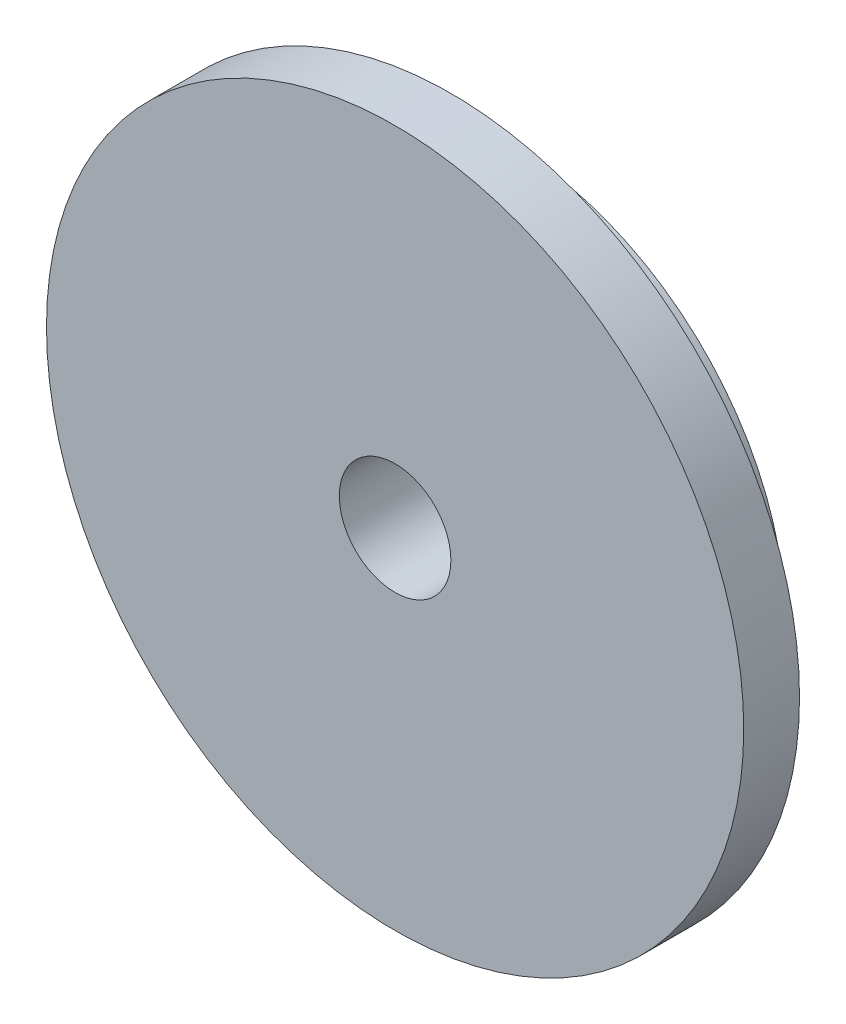
ISO-10303-21;
HEADER;
FILE_DESCRIPTION(('STEP AP214'),'2;1');
FILE_NAME('part.step','',(''),(''),'','','');
FILE_SCHEMA(('AUTOMOTIVE_DESIGN { 1 0 10303 214 1 1 1 1 }'));
ENDSEC;
DATA;
#1=APPLICATION_CONTEXT('core data for automotive mechanical design processes');
#2=APPLICATION_PROTOCOL_DEFINITION('international standard','automotive_design',2000,#1);
#3=PRODUCT_CONTEXT('',#1,'mechanical');
#4=PRODUCT('Part','Part','',(#3));
#5=PRODUCT_RELATED_PRODUCT_CATEGORY('part','',(#4));
#6=PRODUCT_DEFINITION_FORMATION('','',#4);
#7=PRODUCT_DEFINITION_CONTEXT('part definition',#1,'design');
#8=PRODUCT_DEFINITION('design','',#6,#7);
#9=PRODUCT_DEFINITION_SHAPE('','',#8);
#10=(LENGTH_UNIT() NAMED_UNIT(*) SI_UNIT(.MILLI.,.METRE.));
#11=(NAMED_UNIT(*) PLANE_ANGLE_UNIT() SI_UNIT($,.RADIAN.));
#12=(NAMED_UNIT(*) SI_UNIT($,.STERADIAN.) SOLID_ANGLE_UNIT());
#13=UNCERTAINTY_MEASURE_WITH_UNIT(LENGTH_MEASURE(1.E-05),#10,'distance_accuracy_value','');
#14=(GEOMETRIC_REPRESENTATION_CONTEXT(3) GLOBAL_UNCERTAINTY_ASSIGNED_CONTEXT((#13)) GLOBAL_UNIT_ASSIGNED_CONTEXT((#10,
#11,#12)) REPRESENTATION_CONTEXT('',''));
#15=CARTESIAN_POINT('',(0.,0.,0.));
#16=DIRECTION('',(0.,0.,1.));
#17=DIRECTION('',(1.,0.,0.));
#18=AXIS2_PLACEMENT_3D('',#15,#16,#17);
#19=CARTESIAN_POINT('',(0.,0.,4.));
#20=DIRECTION('',(0.,0.,-1.));
#21=DIRECTION('',(-1.,0.,0.));
#22=AXIS2_PLACEMENT_3D('',#19,#20,#21);
#23=CYLINDRICAL_SURFACE('',#22,10.);
#24=CARTESIAN_POINT('',(0.,0.,0.));
#25=DIRECTION('',(0.,0.,1.));
#26=DIRECTION('',(1.,0.,0.));
#27=AXIS2_PLACEMENT_3D('',#24,#25,#26);
#28=CIRCLE('',#27,10.);
#29=CARTESIAN_POINT('',(10.,0.,0.));
#30=VERTEX_POINT('',#29);
#31=EDGE_CURVE('E40',#30,#30,#28,.T.);
#32=ORIENTED_EDGE('',*,*,#31,.T.);
#33=EDGE_LOOP('',(#32));
#34=FACE_BOUND('',#33,.T.);
#35=CARTESIAN_POINT('',(0.,0.,2.));
#36=DIRECTION('',(0.,0.,1.));
#37=DIRECTION('',(1.,0.,0.));
#38=AXIS2_PLACEMENT_3D('',#35,#36,#37);
#39=CIRCLE('',#38,10.);
#40=CARTESIAN_POINT('',(10.,0.,2.));
#41=VERTEX_POINT('',#40);
#42=EDGE_CURVE('E10',#41,#41,#39,.T.);
#43=ORIENTED_EDGE('',*,*,#42,.F.);
#44=EDGE_LOOP('',(#43));
#45=FACE_BOUND('',#44,.T.);
#46=ADVANCED_FACE('F34',(#34,#45),#23,.T.);
#47=CARTESIAN_POINT('',(0.,0.,4.));
#48=DIRECTION('',(0.,0.,1.));
#49=DIRECTION('',(1.,0.,0.));
#50=AXIS2_PLACEMENT_3D('',#47,#48,#49);
#51=PLANE('',#50);
#52=CARTESIAN_POINT('',(0.,0.,4.));
#53=DIRECTION('',(0.,0.,1.));
#54=DIRECTION('',(1.,0.,0.));
#55=AXIS2_PLACEMENT_3D('',#52,#53,#54);
#56=CIRCLE('',#55,2.);
#57=CARTESIAN_POINT('',(2.,0.,4.));
#58=VERTEX_POINT('',#57);
#59=EDGE_CURVE('E44',#58,#58,#56,.T.);
#60=ORIENTED_EDGE('',*,*,#59,.F.);
#61=EDGE_LOOP('',(#60));
#62=FACE_BOUND('',#61,.T.);
#63=CARTESIAN_POINT('',(0.,0.,4.));
#64=DIRECTION('',(0.,0.,1.));
#65=DIRECTION('',(1.,0.,0.));
#66=AXIS2_PLACEMENT_3D('',#63,#64,#65);
#67=CIRCLE('',#66,12.5);
#68=CARTESIAN_POINT('',(12.5,0.,4.));
#69=VERTEX_POINT('',#68);
#70=EDGE_CURVE('E54',#69,#69,#67,.T.);
#71=ORIENTED_EDGE('',*,*,#70,.T.);
#72=EDGE_LOOP('',(#71));
#73=FACE_BOUND('',#72,.T.);
#74=ADVANCED_FACE('F72',(#62,#73),#51,.T.);
#75=CARTESIAN_POINT('',(0.,0.,0.));
#76=DIRECTION('',(0.,0.,1.));
#77=DIRECTION('',(1.,0.,0.));
#78=AXIS2_PLACEMENT_3D('',#75,#76,#77);
#79=PLANE('',#78);
#80=ORIENTED_EDGE('',*,*,#31,.F.);
#81=EDGE_LOOP('',(#80));
#82=FACE_BOUND('',#81,.T.);
#83=CARTESIAN_POINT('',(0.,0.,0.));
#84=DIRECTION('',(0.,0.,1.));
#85=DIRECTION('',(1.,0.,0.));
#86=AXIS2_PLACEMENT_3D('',#83,#84,#85);
#87=CIRCLE('',#86,2.);
#88=CARTESIAN_POINT('',(2.,0.,0.));
#89=VERTEX_POINT('',#88);
#90=EDGE_CURVE('E48',#89,#89,#87,.T.);
#91=ORIENTED_EDGE('',*,*,#90,.T.);
#92=EDGE_LOOP('',(#91));
#93=FACE_BOUND('',#92,.T.);
#94=ADVANCED_FACE('F76',(#82,#93),#79,.F.);
#95=CARTESIAN_POINT('',(0.,0.,4.));
#96=DIRECTION('',(0.,0.,-1.));
#97=DIRECTION('',(-1.,0.,0.));
#98=AXIS2_PLACEMENT_3D('',#95,#96,#97);
#99=CYLINDRICAL_SURFACE('',#98,2.);
#100=ORIENTED_EDGE('',*,*,#59,.T.);
#101=EDGE_LOOP('',(#100));
#102=FACE_BOUND('',#101,.T.);
#103=ORIENTED_EDGE('',*,*,#90,.F.);
#104=EDGE_LOOP('',(#103));
#105=FACE_BOUND('',#104,.T.);
#106=ADVANCED_FACE('F69',(#102,#105),#99,.F.);
#107=CARTESIAN_POINT('',(0.,0.,2.));
#108=DIRECTION('',(0.,0.,1.));
#109=DIRECTION('',(1.,0.,0.));
#110=AXIS2_PLACEMENT_3D('',#107,#108,#109);
#111=CYLINDRICAL_SURFACE('',#110,12.5);
#112=CARTESIAN_POINT('',(0.,0.,2.));
#113=DIRECTION('',(0.,0.,1.));
#114=DIRECTION('',(1.,0.,0.));
#115=AXIS2_PLACEMENT_3D('',#112,#113,#114);
#116=CIRCLE('',#115,12.5);
#117=CARTESIAN_POINT('',(12.5,0.,2.));
#118=VERTEX_POINT('',#117);
#119=EDGE_CURVE('E52',#118,#118,#116,.T.);
#120=ORIENTED_EDGE('',*,*,#119,.T.);
#121=EDGE_LOOP('',(#120));
#122=FACE_BOUND('',#121,.T.);
#123=ORIENTED_EDGE('',*,*,#70,.F.);
#124=EDGE_LOOP('',(#123));
#125=FACE_BOUND('',#124,.T.);
#126=ADVANCED_FACE('F60',(#122,#125),#111,.T.);
#127=CARTESIAN_POINT('',(0.,0.,2.));
#128=DIRECTION('',(0.,0.,1.));
#129=DIRECTION('',(1.,0.,0.));
#130=AXIS2_PLACEMENT_3D('',#127,#128,#129);
#131=PLANE('',#130);
#132=ORIENTED_EDGE('',*,*,#42,.T.);
#133=EDGE_LOOP('',(#132));
#134=FACE_BOUND('',#133,.T.);
#135=ORIENTED_EDGE('',*,*,#119,.F.);
#136=EDGE_LOOP('',(#135));
#137=FACE_BOUND('',#136,.T.);
#138=ADVANCED_FACE('F63',(#134,#137),#131,.F.);
#139=CLOSED_SHELL('',(#46,#74,#94,#106,#126,#138));
#140=MANIFOLD_SOLID_BREP('B2',#139);
#141=ADVANCED_BREP_SHAPE_REPRESENTATION('',(#18,#140),#14);
#142=SHAPE_DEFINITION_REPRESENTATION(#9,#141);
ENDSEC;
END-ISO-10303-21;
